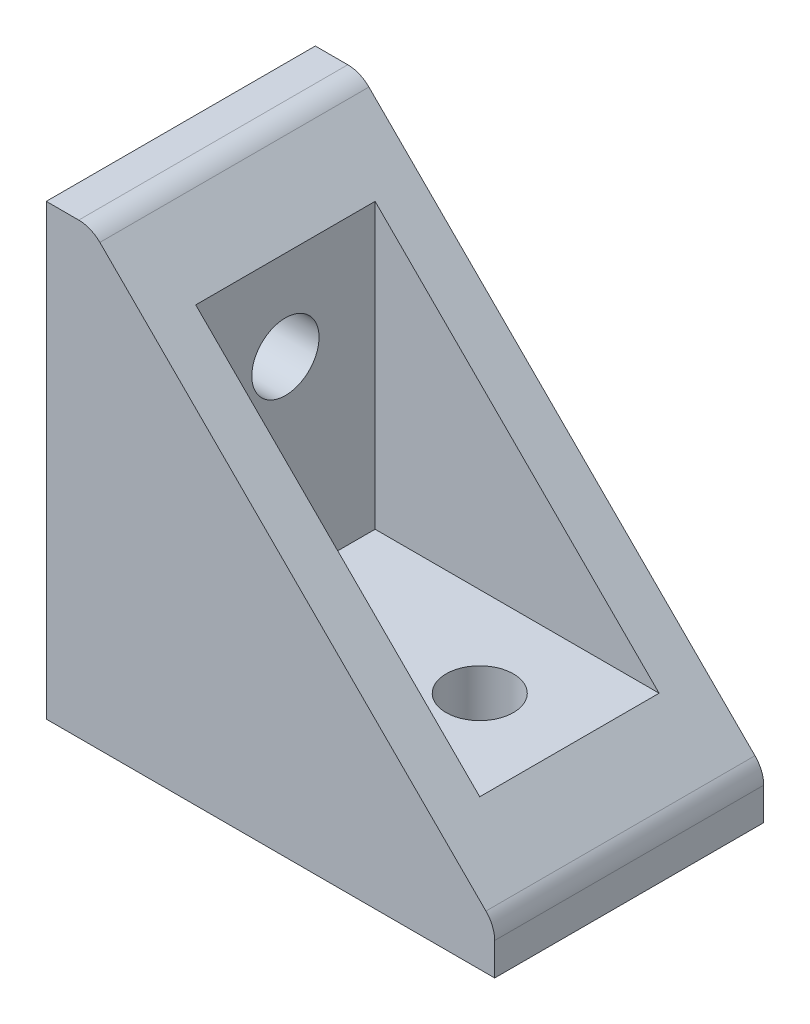
ISO-10303-21;
HEADER;
FILE_DESCRIPTION(('STEP AP214'),'2;1');
FILE_NAME('part.step','',(''),(''),'','','');
FILE_SCHEMA(('AUTOMOTIVE_DESIGN { 1 0 10303 214 1 1 1 1 }'));
ENDSEC;
DATA;
#1=APPLICATION_CONTEXT('core data for automotive mechanical design processes');
#2=APPLICATION_PROTOCOL_DEFINITION('international standard','automotive_design',2000,#1);
#3=PRODUCT_CONTEXT('',#1,'mechanical');
#4=PRODUCT('Part','Part','',(#3));
#5=PRODUCT_RELATED_PRODUCT_CATEGORY('part','',(#4));
#6=PRODUCT_DEFINITION_FORMATION('','',#4);
#7=PRODUCT_DEFINITION_CONTEXT('part definition',#1,'design');
#8=PRODUCT_DEFINITION('design','',#6,#7);
#9=PRODUCT_DEFINITION_SHAPE('','',#8);
#10=(LENGTH_UNIT() NAMED_UNIT(*) SI_UNIT(.MILLI.,.METRE.));
#11=(NAMED_UNIT(*) PLANE_ANGLE_UNIT() SI_UNIT($,.RADIAN.));
#12=(NAMED_UNIT(*) SI_UNIT($,.STERADIAN.) SOLID_ANGLE_UNIT());
#13=UNCERTAINTY_MEASURE_WITH_UNIT(LENGTH_MEASURE(1.E-05),#10,'distance_accuracy_value','');
#14=(GEOMETRIC_REPRESENTATION_CONTEXT(3) GLOBAL_UNCERTAINTY_ASSIGNED_CONTEXT((#13)) GLOBAL_UNIT_ASSIGNED_CONTEXT((#10,
#11,#12)) REPRESENTATION_CONTEXT('',''));
#15=CARTESIAN_POINT('',(0.,0.,0.));
#16=DIRECTION('',(0.,0.,1.));
#17=DIRECTION('',(1.,0.,0.));
#18=AXIS2_PLACEMENT_3D('',#15,#16,#17);
#19=CARTESIAN_POINT('',(0.,0.,-9.));
#20=DIRECTION('',(0.,-1.,0.));
#21=DIRECTION('',(0.,0.,-1.));
#22=AXIS2_PLACEMENT_3D('',#19,#20,#21);
#23=PLANE('',#22);
#24=CARTESIAN_POINT('',(20.,0.,0.));
#25=DIRECTION('',(0.,1.,0.));
#26=DIRECTION('',(-1.,0.,0.));
#27=AXIS2_PLACEMENT_3D('',#24,#25,#26);
#28=CIRCLE('',#27,2.25);
#29=CARTESIAN_POINT('',(17.75,0.,0.));
#30=VERTEX_POINT('',#29);
#31=EDGE_CURVE('E164',#30,#30,#28,.T.);
#32=ORIENTED_EDGE('',*,*,#31,.T.);
#33=EDGE_LOOP('',(#32));
#34=FACE_BOUND('',#33,.T.);
#35=DIRECTION('',(0.,0.,-1.));
#36=VECTOR('',#35,1.);
#37=CARTESIAN_POINT('',(14.,0.,-3.));
#38=LINE('',#37,#36);
#39=CARTESIAN_POINT('',(14.,0.,3.));
#40=VERTEX_POINT('',#39);
#41=CARTESIAN_POINT('',(14.,0.,-3.));
#42=VERTEX_POINT('',#41);
#43=EDGE_CURVE('E185',#40,#42,#38,.T.);
#44=ORIENTED_EDGE('',*,*,#43,.T.);
#45=DIRECTION('',(-1.,0.,0.));
#46=VECTOR('',#45,1.);
#47=CARTESIAN_POINT('',(0.,0.,-3.));
#48=LINE('',#47,#46);
#49=CARTESIAN_POINT('',(0.,0.,-3.));
#50=VERTEX_POINT('',#49);
#51=EDGE_CURVE('E159',#42,#50,#48,.T.);
#52=ORIENTED_EDGE('',*,*,#51,.T.);
#53=DIRECTION('',(0.,0.,1.));
#54=VECTOR('',#53,1.);
#55=CARTESIAN_POINT('',(0.,0.,-9.));
#56=LINE('',#55,#54);
#57=CARTESIAN_POINT('',(0.,0.,-9.));
#58=VERTEX_POINT('',#57);
#59=EDGE_CURVE('E282',#58,#50,#56,.T.);
#60=ORIENTED_EDGE('',*,*,#59,.F.);
#61=DIRECTION('',(1.,0.,0.));
#62=VECTOR('',#61,1.);
#63=CARTESIAN_POINT('',(0.,0.,-9.));
#64=LINE('',#63,#62);
#65=CARTESIAN_POINT('',(30.,0.,-9.));
#66=VERTEX_POINT('',#65);
#67=EDGE_CURVE('E265',#58,#66,#64,.T.);
#68=ORIENTED_EDGE('',*,*,#67,.T.);
#69=DIRECTION('',(0.,0.,1.));
#70=VECTOR('',#69,1.);
#71=CARTESIAN_POINT('',(30.,0.,-9.));
#72=LINE('',#71,#70);
#73=CARTESIAN_POINT('',(30.,0.,9.));
#74=VERTEX_POINT('',#73);
#75=EDGE_CURVE('E280',#66,#74,#72,.T.);
#76=ORIENTED_EDGE('',*,*,#75,.T.);
#77=DIRECTION('',(1.,0.,0.));
#78=VECTOR('',#77,1.);
#79=CARTESIAN_POINT('',(0.,0.,9.));
#80=LINE('',#79,#78);
#81=CARTESIAN_POINT('',(0.,0.,9.));
#82=VERTEX_POINT('',#81);
#83=EDGE_CURVE('E251',#82,#74,#80,.T.);
#84=ORIENTED_EDGE('',*,*,#83,.F.);
#85=CARTESIAN_POINT('',(0.,0.,3.));
#86=VERTEX_POINT('',#85);
#87=EDGE_CURVE('E275',#86,#82,#56,.T.);
#88=ORIENTED_EDGE('',*,*,#87,.F.);
#89=DIRECTION('',(1.,0.,0.));
#90=VECTOR('',#89,1.);
#91=CARTESIAN_POINT('',(0.,0.,3.));
#92=LINE('',#91,#90);
#93=EDGE_CURVE('E187',#86,#40,#92,.T.);
#94=ORIENTED_EDGE('',*,*,#93,.T.);
#95=EDGE_LOOP('',(#44,#52,#60,#68,#76,#84,#88,#94));
#96=FACE_BOUND('',#95,.T.);
#97=ADVANCED_FACE('F34',(#34,#96),#23,.T.);
#98=DIRECTION('',(1.,0.,0.));
#99=VECTOR('',#98,1.);
#100=CARTESIAN_POINT('',(-3.,0.,-3.));
#101=LINE('',#100,#99);
#102=CARTESIAN_POINT('',(-3.,0.,-3.));
#103=VERTEX_POINT('',#102);
#104=EDGE_CURVE('E226',#103,#50,#101,.T.);
#105=ORIENTED_EDGE('',*,*,#104,.T.);
#106=DIRECTION('',(0.,0.,1.));
#107=VECTOR('',#106,1.);
#108=CARTESIAN_POINT('',(0.,0.,-3.));
#109=LINE('',#108,#107);
#110=EDGE_CURVE('E175',#50,#86,#109,.T.);
#111=ORIENTED_EDGE('',*,*,#110,.T.);
#112=DIRECTION('',(1.,0.,0.));
#113=VECTOR('',#112,1.);
#114=CARTESIAN_POINT('',(-3.,0.,3.));
#115=LINE('',#114,#113);
#116=CARTESIAN_POINT('',(-3.,0.,3.));
#117=VERTEX_POINT('',#116);
#118=EDGE_CURVE('E223',#117,#86,#115,.T.);
#119=ORIENTED_EDGE('',*,*,#118,.F.);
#120=DIRECTION('',(0.,0.,1.));
#121=VECTOR('',#120,1.);
#122=CARTESIAN_POINT('',(-3.,0.,-3.));
#123=LINE('',#122,#121);
#124=EDGE_CURVE('E202',#103,#117,#123,.T.);
#125=ORIENTED_EDGE('',*,*,#124,.F.);
#126=EDGE_LOOP('',(#105,#111,#119,#125));
#127=FACE_BOUND('',#126,.T.);
#128=ADVANCED_FACE('F339',(#127),#23,.T.);
#129=CARTESIAN_POINT('',(0.,30.,-9.));
#130=DIRECTION('',(-1.,0.,0.));
#131=DIRECTION('',(0.,-1.,0.));
#132=AXIS2_PLACEMENT_3D('',#129,#130,#131);
#133=PLANE('',#132);
#134=DIRECTION('',(0.,-1.,0.));
#135=VECTOR('',#134,1.);
#136=CARTESIAN_POINT('',(0.,0.,-3.));
#137=LINE('',#136,#135);
#138=CARTESIAN_POINT('',(0.,14.,-3.));
#139=VERTEX_POINT('',#138);
#140=EDGE_CURVE('E210',#139,#50,#137,.T.);
#141=ORIENTED_EDGE('',*,*,#140,.F.);
#142=DIRECTION('',(0.,0.,-1.));
#143=VECTOR('',#142,1.);
#144=CARTESIAN_POINT('',(0.,14.,-3.));
#145=LINE('',#144,#143);
#146=CARTESIAN_POINT('',(0.,14.,3.));
#147=VERTEX_POINT('',#146);
#148=EDGE_CURVE('E203',#147,#139,#145,.T.);
#149=ORIENTED_EDGE('',*,*,#148,.F.);
#150=DIRECTION('',(0.,1.,0.));
#151=VECTOR('',#150,1.);
#152=CARTESIAN_POINT('',(0.,0.,3.));
#153=LINE('',#152,#151);
#154=EDGE_CURVE('E213',#86,#147,#153,.T.);
#155=ORIENTED_EDGE('',*,*,#154,.F.);
#156=ORIENTED_EDGE('',*,*,#87,.T.);
#157=DIRECTION('',(0.,-1.,0.));
#158=VECTOR('',#157,1.);
#159=CARTESIAN_POINT('',(0.,30.,9.));
#160=LINE('',#159,#158);
#161=CARTESIAN_POINT('',(0.,30.,9.));
#162=VERTEX_POINT('',#161);
#163=EDGE_CURVE('E248',#162,#82,#160,.T.);
#164=ORIENTED_EDGE('',*,*,#163,.F.);
#165=DIRECTION('',(0.,0.,1.));
#166=VECTOR('',#165,1.);
#167=CARTESIAN_POINT('',(0.,30.,-9.));
#168=LINE('',#167,#166);
#169=CARTESIAN_POINT('',(0.,30.,-9.));
#170=VERTEX_POINT('',#169);
#171=EDGE_CURVE('E276',#170,#162,#168,.T.);
#172=ORIENTED_EDGE('',*,*,#171,.F.);
#173=DIRECTION('',(0.,-1.,0.));
#174=VECTOR('',#173,1.);
#175=CARTESIAN_POINT('',(0.,30.,-9.));
#176=LINE('',#175,#174);
#177=EDGE_CURVE('E262',#170,#58,#176,.T.);
#178=ORIENTED_EDGE('',*,*,#177,.T.);
#179=ORIENTED_EDGE('',*,*,#59,.T.);
#180=EDGE_LOOP('',(#141,#149,#155,#156,#164,#172,#178,#179));
#181=FACE_BOUND('',#180,.T.);
#182=CARTESIAN_POINT('',(0.,20.,0.));
#183=DIRECTION('',(-1.,0.,0.));
#184=DIRECTION('',(0.,-1.,0.));
#185=AXIS2_PLACEMENT_3D('',#182,#183,#184);
#186=CIRCLE('',#185,2.25);
#187=CARTESIAN_POINT('',(0.,17.75,0.));
#188=VERTEX_POINT('',#187);
#189=EDGE_CURVE('E245',#188,#188,#186,.T.);
#190=ORIENTED_EDGE('',*,*,#189,.F.);
#191=EDGE_LOOP('',(#190));
#192=FACE_BOUND('',#191,.T.);
#193=ADVANCED_FACE('F331',(#181,#192),#133,.T.);
#194=CARTESIAN_POINT('',(3.,30.,-9.));
#195=DIRECTION('',(0.,1.,0.));
#196=DIRECTION('',(0.,0.,1.));
#197=AXIS2_PLACEMENT_3D('',#194,#195,#196);
#198=PLANE('',#197);
#199=DIRECTION('',(-1.,0.,0.));
#200=VECTOR('',#199,1.);
#201=CARTESIAN_POINT('',(3.,30.,9.));
#202=LINE('',#201,#200);
#203=CARTESIAN_POINT('',(2.17157287525381,30.,9.));
#204=VERTEX_POINT('',#203);
#205=EDGE_CURVE('E260',#204,#162,#202,.T.);
#206=ORIENTED_EDGE('',*,*,#205,.F.);
#207=DIRECTION('',(0.,0.,1.));
#208=VECTOR('',#207,1.);
#209=CARTESIAN_POINT('',(2.17157287525381,30.,-9.));
#210=LINE('',#209,#208);
#211=CARTESIAN_POINT('',(2.17157287525381,30.,-9.));
#212=VERTEX_POINT('',#211);
#213=EDGE_CURVE('E11',#204,#212,#210,.F.);
#214=ORIENTED_EDGE('',*,*,#213,.T.);
#215=DIRECTION('',(-1.,0.,0.));
#216=VECTOR('',#215,1.);
#217=CARTESIAN_POINT('',(3.,30.,-9.));
#218=LINE('',#217,#216);
#219=EDGE_CURVE('E273',#212,#170,#218,.T.);
#220=ORIENTED_EDGE('',*,*,#219,.T.);
#221=ORIENTED_EDGE('',*,*,#171,.T.);
#222=EDGE_LOOP('',(#206,#214,#220,#221));
#223=FACE_BOUND('',#222,.T.);
#224=ADVANCED_FACE('F326',(#223),#198,.T.);
#225=CARTESIAN_POINT('',(30.,3.,-9.));
#226=DIRECTION('',(0.707106781186547,0.707106781186548,0.));
#227=DIRECTION('',(-0.707106781186548,0.707106781186547,0.));
#228=AXIS2_PLACEMENT_3D('',#225,#226,#227);
#229=PLANE('',#228);
#230=DIRECTION('',(0.,0.,1.));
#231=VECTOR('',#230,1.);
#232=CARTESIAN_POINT('',(7.,26.,-8.99999999999999));
#233=LINE('',#232,#231);
#234=CARTESIAN_POINT('',(7.,26.,-6.));
#235=VERTEX_POINT('',#234);
#236=CARTESIAN_POINT('',(7.,26.,6.));
#237=VERTEX_POINT('',#236);
#238=EDGE_CURVE('E243',#235,#237,#233,.T.);
#239=ORIENTED_EDGE('',*,*,#238,.F.);
#240=DIRECTION('',(-0.707106781186548,0.707106781186547,0.));
#241=VECTOR('',#240,1.);
#242=CARTESIAN_POINT('',(30.,3.,-6.));
#243=LINE('',#242,#241);
#244=CARTESIAN_POINT('',(26.,6.99999999999999,-6.));
#245=VERTEX_POINT('',#244);
#246=EDGE_CURVE('E292',#245,#235,#243,.T.);
#247=ORIENTED_EDGE('',*,*,#246,.F.);
#248=DIRECTION('',(0.,0.,1.));
#249=VECTOR('',#248,1.);
#250=CARTESIAN_POINT('',(26.,6.99999999999999,-9.));
#251=LINE('',#250,#249);
#252=CARTESIAN_POINT('',(26.,6.99999999999999,6.));
#253=VERTEX_POINT('',#252);
#254=EDGE_CURVE('E279',#245,#253,#251,.T.);
#255=ORIENTED_EDGE('',*,*,#254,.T.);
#256=DIRECTION('',(0.707106781186548,-0.707106781186547,0.));
#257=VECTOR('',#256,1.);
#258=CARTESIAN_POINT('',(30.,3.,6.));
#259=LINE('',#258,#257);
#260=EDGE_CURVE('E289',#237,#253,#259,.T.);
#261=ORIENTED_EDGE('',*,*,#260,.F.);
#262=EDGE_LOOP('',(#239,#247,#255,#261));
#263=FACE_BOUND('',#262,.T.);
#264=DIRECTION('',(-0.707106781186548,0.707106781186547,0.));
#265=VECTOR('',#264,1.);
#266=CARTESIAN_POINT('',(30.,3.,9.));
#267=LINE('',#266,#265);
#268=CARTESIAN_POINT('',(29.4142135623731,3.58578643762691,9.));
#269=VERTEX_POINT('',#268);
#270=CARTESIAN_POINT('',(3.5857864376269,29.4142135623731,9.));
#271=VERTEX_POINT('',#270);
#272=EDGE_CURVE('E257',#269,#271,#267,.T.);
#273=ORIENTED_EDGE('',*,*,#272,.F.);
#274=DIRECTION('',(0.,0.,1.));
#275=VECTOR('',#274,1.);
#276=CARTESIAN_POINT('',(29.4142135623731,3.58578643762691,-9.));
#277=LINE('',#276,#275);
#278=CARTESIAN_POINT('',(29.4142135623731,3.58578643762691,-9.));
#279=VERTEX_POINT('',#278);
#280=EDGE_CURVE('E306',#269,#279,#277,.F.);
#281=ORIENTED_EDGE('',*,*,#280,.T.);
#282=DIRECTION('',(-0.707106781186548,0.707106781186547,0.));
#283=VECTOR('',#282,1.);
#284=CARTESIAN_POINT('',(30.,3.,-9.));
#285=LINE('',#284,#283);
#286=CARTESIAN_POINT('',(3.5857864376269,29.4142135623731,-9.));
#287=VERTEX_POINT('',#286);
#288=EDGE_CURVE('E271',#279,#287,#285,.T.);
#289=ORIENTED_EDGE('',*,*,#288,.T.);
#290=DIRECTION('',(0.,0.,1.));
#291=VECTOR('',#290,1.);
#292=CARTESIAN_POINT('',(3.5857864376269,29.4142135623731,-9.));
#293=LINE('',#292,#291);
#294=EDGE_CURVE('E303',#287,#271,#293,.T.);
#295=ORIENTED_EDGE('',*,*,#294,.T.);
#296=EDGE_LOOP('',(#273,#281,#289,#295));
#297=FACE_BOUND('',#296,.T.);
#298=ADVANCED_FACE('F323',(#263,#297),#229,.T.);
#299=CARTESIAN_POINT('',(30.,0.,-9.));
#300=DIRECTION('',(1.,0.,0.));
#301=DIRECTION('',(0.,0.,-1.));
#302=AXIS2_PLACEMENT_3D('',#299,#300,#301);
#303=PLANE('',#302);
#304=DIRECTION('',(0.,1.,0.));
#305=VECTOR('',#304,1.);
#306=CARTESIAN_POINT('',(30.,0.,-9.));
#307=LINE('',#306,#305);
#308=CARTESIAN_POINT('',(30.,2.17157287525381,-9.));
#309=VERTEX_POINT('',#308);
#310=EDGE_CURVE('E268',#66,#309,#307,.T.);
#311=ORIENTED_EDGE('',*,*,#310,.T.);
#312=DIRECTION('',(0.,0.,1.));
#313=VECTOR('',#312,1.);
#314=CARTESIAN_POINT('',(30.,2.17157287525381,-9.));
#315=LINE('',#314,#313);
#316=CARTESIAN_POINT('',(30.,2.17157287525381,9.));
#317=VERTEX_POINT('',#316);
#318=EDGE_CURVE('E294',#309,#317,#315,.T.);
#319=ORIENTED_EDGE('',*,*,#318,.T.);
#320=DIRECTION('',(0.,1.,0.));
#321=VECTOR('',#320,1.);
#322=CARTESIAN_POINT('',(30.,0.,9.));
#323=LINE('',#322,#321);
#324=EDGE_CURVE('E254',#74,#317,#323,.T.);
#325=ORIENTED_EDGE('',*,*,#324,.F.);
#326=ORIENTED_EDGE('',*,*,#75,.F.);
#327=EDGE_LOOP('',(#311,#319,#325,#326));
#328=FACE_BOUND('',#327,.T.);
#329=ADVANCED_FACE('F316',(#328),#303,.T.);
#330=CARTESIAN_POINT('',(0.,0.,-9.));
#331=DIRECTION('',(0.,0.,1.));
#332=DIRECTION('',(1.,0.,0.));
#333=AXIS2_PLACEMENT_3D('',#330,#331,#332);
#334=PLANE('',#333);
#335=ORIENTED_EDGE('',*,*,#288,.F.);
#336=CARTESIAN_POINT('',(28.,2.17157287525381,-9.));
#337=DIRECTION('',(0.,0.,1.));
#338=DIRECTION('',(1.,0.,0.));
#339=AXIS2_PLACEMENT_3D('',#336,#337,#338);
#340=CIRCLE('',#339,2.);
#341=EDGE_CURVE('E42',#279,#309,#340,.F.);
#342=ORIENTED_EDGE('',*,*,#341,.T.);
#343=ORIENTED_EDGE('',*,*,#310,.F.);
#344=ORIENTED_EDGE('',*,*,#67,.F.);
#345=ORIENTED_EDGE('',*,*,#177,.F.);
#346=ORIENTED_EDGE('',*,*,#219,.F.);
#347=CARTESIAN_POINT('',(2.17157287525381,28.,-9.));
#348=DIRECTION('',(0.,0.,1.));
#349=DIRECTION('',(1.,0.,0.));
#350=AXIS2_PLACEMENT_3D('',#347,#348,#349);
#351=CIRCLE('',#350,2.);
#352=EDGE_CURVE('E54',#212,#287,#351,.F.);
#353=ORIENTED_EDGE('',*,*,#352,.T.);
#354=EDGE_LOOP('',(#335,#342,#343,#344,#345,#346,#353));
#355=FACE_BOUND('',#354,.T.);
#356=ADVANCED_FACE('F310',(#355),#334,.F.);
#357=CARTESIAN_POINT('',(0.,0.,9.));
#358=DIRECTION('',(0.,0.,1.));
#359=DIRECTION('',(1.,0.,0.));
#360=AXIS2_PLACEMENT_3D('',#357,#358,#359);
#361=PLANE('',#360);
#362=ORIENTED_EDGE('',*,*,#324,.T.);
#363=CARTESIAN_POINT('',(28.,2.17157287525381,9.));
#364=DIRECTION('',(0.,0.,1.));
#365=DIRECTION('',(1.,0.,0.));
#366=AXIS2_PLACEMENT_3D('',#363,#364,#365);
#367=CIRCLE('',#366,2.);
#368=EDGE_CURVE('E301',#317,#269,#367,.T.);
#369=ORIENTED_EDGE('',*,*,#368,.T.);
#370=ORIENTED_EDGE('',*,*,#272,.T.);
#371=CARTESIAN_POINT('',(2.17157287525381,28.,9.));
#372=DIRECTION('',(0.,0.,1.));
#373=DIRECTION('',(1.,0.,0.));
#374=AXIS2_PLACEMENT_3D('',#371,#372,#373);
#375=CIRCLE('',#374,2.);
#376=EDGE_CURVE('E299',#271,#204,#375,.T.);
#377=ORIENTED_EDGE('',*,*,#376,.T.);
#378=ORIENTED_EDGE('',*,*,#205,.T.);
#379=ORIENTED_EDGE('',*,*,#163,.T.);
#380=ORIENTED_EDGE('',*,*,#83,.T.);
#381=EDGE_LOOP('',(#362,#369,#370,#377,#378,#379,#380));
#382=FACE_BOUND('',#381,.T.);
#383=ADVANCED_FACE('F321',(#382),#361,.T.);
#384=CARTESIAN_POINT('',(30.,20.,0.));
#385=DIRECTION('',(-1.,0.,0.));
#386=DIRECTION('',(0.,-1.,0.));
#387=AXIS2_PLACEMENT_3D('',#384,#385,#386);
#388=CYLINDRICAL_SURFACE('',#387,2.25);
#389=CARTESIAN_POINT('',(7.,20.,0.));
#390=DIRECTION('',(-1.,0.,0.));
#391=DIRECTION('',(0.,0.,1.));
#392=AXIS2_PLACEMENT_3D('',#389,#390,#391);
#393=CIRCLE('',#392,2.25);
#394=CARTESIAN_POINT('',(7.,20.,2.25));
#395=VERTEX_POINT('',#394);
#396=EDGE_CURVE('E240',#395,#395,#393,.F.);
#397=ORIENTED_EDGE('',*,*,#396,.T.);
#398=EDGE_LOOP('',(#397));
#399=FACE_BOUND('',#398,.T.);
#400=ORIENTED_EDGE('',*,*,#189,.T.);
#401=EDGE_LOOP('',(#400));
#402=FACE_BOUND('',#401,.T.);
#403=ADVANCED_FACE('F456',(#399,#402),#388,.F.);
#404=CARTESIAN_POINT('',(7.,6.99999999999999,-6.));
#405=DIRECTION('',(-1.,0.,0.));
#406=DIRECTION('',(0.,0.,1.));
#407=AXIS2_PLACEMENT_3D('',#404,#405,#406);
#408=PLANE('',#407);
#409=ORIENTED_EDGE('',*,*,#238,.T.);
#410=DIRECTION('',(0.,1.,0.));
#411=VECTOR('',#410,1.);
#412=CARTESIAN_POINT('',(7.,6.99999999999999,6.));
#413=LINE('',#412,#411);
#414=CARTESIAN_POINT('',(7.,6.99999999999999,6.));
#415=VERTEX_POINT('',#414);
#416=EDGE_CURVE('E236',#415,#237,#413,.T.);
#417=ORIENTED_EDGE('',*,*,#416,.F.);
#418=DIRECTION('',(0.,0.,1.));
#419=VECTOR('',#418,1.);
#420=CARTESIAN_POINT('',(7.,6.99999999999999,-6.));
#421=LINE('',#420,#419);
#422=CARTESIAN_POINT('',(7.,6.99999999999999,-6.));
#423=VERTEX_POINT('',#422);
#424=EDGE_CURVE('E229',#423,#415,#421,.T.);
#425=ORIENTED_EDGE('',*,*,#424,.F.);
#426=DIRECTION('',(0.,1.,0.));
#427=VECTOR('',#426,1.);
#428=CARTESIAN_POINT('',(7.,6.99999999999999,-6.));
#429=LINE('',#428,#427);
#430=EDGE_CURVE('E237',#423,#235,#429,.T.);
#431=ORIENTED_EDGE('',*,*,#430,.T.);
#432=EDGE_LOOP('',(#409,#417,#425,#431));
#433=FACE_BOUND('',#432,.T.);
#434=ORIENTED_EDGE('',*,*,#396,.F.);
#435=EDGE_LOOP('',(#434));
#436=FACE_BOUND('',#435,.T.);
#437=ADVANCED_FACE('F475',(#433,#436),#408,.F.);
#438=CARTESIAN_POINT('',(7.,6.99999999999999,-6.));
#439=DIRECTION('',(0.,0.,-1.));
#440=DIRECTION('',(-1.,0.,0.));
#441=AXIS2_PLACEMENT_3D('',#438,#439,#440);
#442=PLANE('',#441);
#443=ORIENTED_EDGE('',*,*,#246,.T.);
#444=ORIENTED_EDGE('',*,*,#430,.F.);
#445=DIRECTION('',(-1.,0.,0.));
#446=VECTOR('',#445,1.);
#447=CARTESIAN_POINT('',(7.,6.99999999999999,-6.));
#448=LINE('',#447,#446);
#449=EDGE_CURVE('E234',#245,#423,#448,.T.);
#450=ORIENTED_EDGE('',*,*,#449,.F.);
#451=EDGE_LOOP('',(#443,#444,#450));
#452=FACE_BOUND('',#451,.T.);
#453=ADVANCED_FACE('F482',(#452),#442,.F.);
#454=CARTESIAN_POINT('',(7.,6.99999999999999,6.));
#455=DIRECTION('',(0.,0.,1.));
#456=DIRECTION('',(1.,0.,0.));
#457=AXIS2_PLACEMENT_3D('',#454,#455,#456);
#458=PLANE('',#457);
#459=ORIENTED_EDGE('',*,*,#260,.T.);
#460=DIRECTION('',(1.,0.,0.));
#461=VECTOR('',#460,1.);
#462=CARTESIAN_POINT('',(7.,6.99999999999999,6.));
#463=LINE('',#462,#461);
#464=EDGE_CURVE('E232',#415,#253,#463,.T.);
#465=ORIENTED_EDGE('',*,*,#464,.F.);
#466=ORIENTED_EDGE('',*,*,#416,.T.);
#467=EDGE_LOOP('',(#459,#465,#466));
#468=FACE_BOUND('',#467,.T.);
#469=ADVANCED_FACE('F490',(#468),#458,.F.);
#470=CARTESIAN_POINT('',(0.,6.99999999999999,0.));
#471=DIRECTION('',(0.,1.,0.));
#472=DIRECTION('',(0.,0.,1.));
#473=AXIS2_PLACEMENT_3D('',#470,#471,#472);
#474=PLANE('',#473);
#475=CARTESIAN_POINT('',(20.,6.99999999999999,0.));
#476=DIRECTION('',(0.,1.,0.));
#477=DIRECTION('',(0.,0.,1.));
#478=AXIS2_PLACEMENT_3D('',#475,#476,#477);
#479=CIRCLE('',#478,2.25);
#480=CARTESIAN_POINT('',(20.,6.99999999999999,2.25));
#481=VERTEX_POINT('',#480);
#482=EDGE_CURVE('E198',#481,#481,#479,.F.);
#483=ORIENTED_EDGE('',*,*,#482,.T.);
#484=EDGE_LOOP('',(#483));
#485=FACE_BOUND('',#484,.T.);
#486=ORIENTED_EDGE('',*,*,#449,.T.);
#487=ORIENTED_EDGE('',*,*,#424,.T.);
#488=ORIENTED_EDGE('',*,*,#464,.T.);
#489=ORIENTED_EDGE('',*,*,#254,.F.);
#490=EDGE_LOOP('',(#486,#487,#488,#489));
#491=FACE_BOUND('',#490,.T.);
#492=ADVANCED_FACE('F498',(#485,#491),#474,.T.);
#493=CARTESIAN_POINT('',(-3.,0.,-3.));
#494=DIRECTION('',(0.,0.,1.));
#495=DIRECTION('',(1.,0.,0.));
#496=AXIS2_PLACEMENT_3D('',#493,#494,#495);
#497=PLANE('',#496);
#498=ORIENTED_EDGE('',*,*,#140,.T.);
#499=ORIENTED_EDGE('',*,*,#104,.F.);
#500=DIRECTION('',(0.,-1.,0.));
#501=VECTOR('',#500,1.);
#502=CARTESIAN_POINT('',(-3.,0.,-3.));
#503=LINE('',#502,#501);
#504=CARTESIAN_POINT('',(-3.,14.,-3.));
#505=VERTEX_POINT('',#504);
#506=EDGE_CURVE('E199',#505,#103,#503,.T.);
#507=ORIENTED_EDGE('',*,*,#506,.F.);
#508=DIRECTION('',(1.,0.,0.));
#509=VECTOR('',#508,1.);
#510=CARTESIAN_POINT('',(-3.,14.,-3.));
#511=LINE('',#510,#509);
#512=EDGE_CURVE('E209',#505,#139,#511,.T.);
#513=ORIENTED_EDGE('',*,*,#512,.T.);
#514=EDGE_LOOP('',(#498,#499,#507,#513));
#515=FACE_BOUND('',#514,.T.);
#516=ADVANCED_FACE('F344',(#515),#497,.F.);
#517=CARTESIAN_POINT('',(-3.,0.,3.));
#518=DIRECTION('',(0.,0.,-1.));
#519=DIRECTION('',(-1.,0.,0.));
#520=AXIS2_PLACEMENT_3D('',#517,#518,#519);
#521=PLANE('',#520);
#522=ORIENTED_EDGE('',*,*,#154,.T.);
#523=DIRECTION('',(1.,0.,0.));
#524=VECTOR('',#523,1.);
#525=CARTESIAN_POINT('',(-3.,14.,3.));
#526=LINE('',#525,#524);
#527=CARTESIAN_POINT('',(-3.,14.,3.));
#528=VERTEX_POINT('',#527);
#529=EDGE_CURVE('E220',#528,#147,#526,.T.);
#530=ORIENTED_EDGE('',*,*,#529,.F.);
#531=DIRECTION('',(0.,1.,0.));
#532=VECTOR('',#531,1.);
#533=CARTESIAN_POINT('',(-3.,0.,3.));
#534=LINE('',#533,#532);
#535=EDGE_CURVE('E205',#117,#528,#534,.T.);
#536=ORIENTED_EDGE('',*,*,#535,.F.);
#537=ORIENTED_EDGE('',*,*,#118,.T.);
#538=EDGE_LOOP('',(#522,#530,#536,#537));
#539=FACE_BOUND('',#538,.T.);
#540=ADVANCED_FACE('F351',(#539),#521,.F.);
#541=CARTESIAN_POINT('',(-3.,14.,-3.));
#542=DIRECTION('',(0.,-1.,0.));
#543=DIRECTION('',(1.,0.,0.));
#544=AXIS2_PLACEMENT_3D('',#541,#542,#543);
#545=PLANE('',#544);
#546=ORIENTED_EDGE('',*,*,#148,.T.);
#547=ORIENTED_EDGE('',*,*,#512,.F.);
#548=DIRECTION('',(0.,0.,-1.));
#549=VECTOR('',#548,1.);
#550=CARTESIAN_POINT('',(-3.,14.,-3.));
#551=LINE('',#550,#549);
#552=EDGE_CURVE('E207',#528,#505,#551,.T.);
#553=ORIENTED_EDGE('',*,*,#552,.F.);
#554=ORIENTED_EDGE('',*,*,#529,.T.);
#555=EDGE_LOOP('',(#546,#547,#553,#554));
#556=FACE_BOUND('',#555,.T.);
#557=ADVANCED_FACE('F348',(#556),#545,.F.);
#558=CARTESIAN_POINT('',(-3.,0.,0.));
#559=DIRECTION('',(1.,0.,0.));
#560=DIRECTION('',(0.,1.,0.));
#561=AXIS2_PLACEMENT_3D('',#558,#559,#560);
#562=PLANE('',#561);
#563=ORIENTED_EDGE('',*,*,#506,.T.);
#564=ORIENTED_EDGE('',*,*,#124,.T.);
#565=ORIENTED_EDGE('',*,*,#535,.T.);
#566=ORIENTED_EDGE('',*,*,#552,.T.);
#567=EDGE_LOOP('',(#563,#564,#565,#566));
#568=FACE_BOUND('',#567,.T.);
#569=ADVANCED_FACE('F354',(#568),#562,.F.);
#570=CARTESIAN_POINT('',(20.,30.,0.));
#571=DIRECTION('',(0.,-1.,0.));
#572=DIRECTION('',(1.,0.,0.));
#573=AXIS2_PLACEMENT_3D('',#570,#571,#572);
#574=CYLINDRICAL_SURFACE('',#573,2.25);
#575=ORIENTED_EDGE('',*,*,#482,.F.);
#576=EDGE_LOOP('',(#575));
#577=FACE_BOUND('',#576,.T.);
#578=ORIENTED_EDGE('',*,*,#31,.F.);
#579=EDGE_LOOP('',(#578));
#580=FACE_BOUND('',#579,.T.);
#581=ADVANCED_FACE('F356',(#577,#580),#574,.F.);
#582=CARTESIAN_POINT('',(0.,-3.,-3.));
#583=DIRECTION('',(0.,0.,-1.));
#584=DIRECTION('',(-1.,0.,0.));
#585=AXIS2_PLACEMENT_3D('',#582,#583,#584);
#586=PLANE('',#585);
#587=ORIENTED_EDGE('',*,*,#51,.F.);
#588=DIRECTION('',(0.,1.,0.));
#589=VECTOR('',#588,1.);
#590=CARTESIAN_POINT('',(14.,-3.,-3.));
#591=LINE('',#590,#589);
#592=CARTESIAN_POINT('',(14.,-3.,-3.));
#593=VERTEX_POINT('',#592);
#594=EDGE_CURVE('E153',#593,#42,#591,.T.);
#595=ORIENTED_EDGE('',*,*,#594,.F.);
#596=DIRECTION('',(-1.,0.,0.));
#597=VECTOR('',#596,1.);
#598=CARTESIAN_POINT('',(0.,-3.,-3.));
#599=LINE('',#598,#597);
#600=CARTESIAN_POINT('',(0.,-3.,-3.));
#601=VERTEX_POINT('',#600);
#602=EDGE_CURVE('E156',#593,#601,#599,.T.);
#603=ORIENTED_EDGE('',*,*,#602,.T.);
#604=DIRECTION('',(0.,1.,0.));
#605=VECTOR('',#604,1.);
#606=CARTESIAN_POINT('',(0.,-3.,-3.));
#607=LINE('',#606,#605);
#608=EDGE_CURVE('E183',#601,#50,#607,.T.);
#609=ORIENTED_EDGE('',*,*,#608,.T.);
#610=EDGE_LOOP('',(#587,#595,#603,#609));
#611=FACE_BOUND('',#610,.T.);
#612=ADVANCED_FACE('F155',(#611),#586,.T.);
#613=CARTESIAN_POINT('',(14.,-3.,-3.));
#614=DIRECTION('',(1.,0.,0.));
#615=DIRECTION('',(0.,1.,0.));
#616=AXIS2_PLACEMENT_3D('',#613,#614,#615);
#617=PLANE('',#616);
#618=ORIENTED_EDGE('',*,*,#43,.F.);
#619=DIRECTION('',(0.,1.,0.));
#620=VECTOR('',#619,1.);
#621=CARTESIAN_POINT('',(14.,-3.,3.));
#622=LINE('',#621,#620);
#623=CARTESIAN_POINT('',(14.,-3.,3.));
#624=VERTEX_POINT('',#623);
#625=EDGE_CURVE('E165',#624,#40,#622,.T.);
#626=ORIENTED_EDGE('',*,*,#625,.F.);
#627=DIRECTION('',(0.,0.,-1.));
#628=VECTOR('',#627,1.);
#629=CARTESIAN_POINT('',(14.,-3.,-3.));
#630=LINE('',#629,#628);
#631=EDGE_CURVE('E171',#624,#593,#630,.T.);
#632=ORIENTED_EDGE('',*,*,#631,.T.);
#633=ORIENTED_EDGE('',*,*,#594,.T.);
#634=EDGE_LOOP('',(#618,#626,#632,#633));
#635=FACE_BOUND('',#634,.T.);
#636=ADVANCED_FACE('F177',(#635),#617,.T.);
#637=CARTESIAN_POINT('',(0.,-3.,3.));
#638=DIRECTION('',(0.,0.,1.));
#639=DIRECTION('',(1.,0.,0.));
#640=AXIS2_PLACEMENT_3D('',#637,#638,#639);
#641=PLANE('',#640);
#642=ORIENTED_EDGE('',*,*,#93,.F.);
#643=DIRECTION('',(0.,1.,0.));
#644=VECTOR('',#643,1.);
#645=CARTESIAN_POINT('',(0.,-3.,3.));
#646=LINE('',#645,#644);
#647=CARTESIAN_POINT('',(0.,-3.,3.));
#648=VERTEX_POINT('',#647);
#649=EDGE_CURVE('E193',#648,#86,#646,.T.);
#650=ORIENTED_EDGE('',*,*,#649,.F.);
#651=DIRECTION('',(1.,0.,0.));
#652=VECTOR('',#651,1.);
#653=CARTESIAN_POINT('',(0.,-3.,3.));
#654=LINE('',#653,#652);
#655=EDGE_CURVE('E178',#648,#624,#654,.T.);
#656=ORIENTED_EDGE('',*,*,#655,.T.);
#657=ORIENTED_EDGE('',*,*,#625,.T.);
#658=EDGE_LOOP('',(#642,#650,#656,#657));
#659=FACE_BOUND('',#658,.T.);
#660=ADVANCED_FACE('F385',(#659),#641,.T.);
#661=CARTESIAN_POINT('',(0.,-3.,-3.));
#662=DIRECTION('',(-1.,0.,0.));
#663=DIRECTION('',(0.,-1.,0.));
#664=AXIS2_PLACEMENT_3D('',#661,#662,#663);
#665=PLANE('',#664);
#666=ORIENTED_EDGE('',*,*,#110,.F.);
#667=ORIENTED_EDGE('',*,*,#608,.F.);
#668=DIRECTION('',(0.,0.,1.));
#669=VECTOR('',#668,1.);
#670=CARTESIAN_POINT('',(0.,-3.,-3.));
#671=LINE('',#670,#669);
#672=EDGE_CURVE('E174',#601,#648,#671,.T.);
#673=ORIENTED_EDGE('',*,*,#672,.T.);
#674=ORIENTED_EDGE('',*,*,#649,.T.);
#675=EDGE_LOOP('',(#666,#667,#673,#674));
#676=FACE_BOUND('',#675,.T.);
#677=ADVANCED_FACE('F380',(#676),#665,.T.);
#678=CARTESIAN_POINT('',(0.,-3.,0.));
#679=DIRECTION('',(0.,1.,0.));
#680=DIRECTION('',(1.,0.,0.));
#681=AXIS2_PLACEMENT_3D('',#678,#679,#680);
#682=PLANE('',#681);
#683=ORIENTED_EDGE('',*,*,#602,.F.);
#684=ORIENTED_EDGE('',*,*,#631,.F.);
#685=ORIENTED_EDGE('',*,*,#655,.F.);
#686=ORIENTED_EDGE('',*,*,#672,.F.);
#687=EDGE_LOOP('',(#683,#684,#685,#686));
#688=FACE_BOUND('',#687,.T.);
#689=ADVANCED_FACE('F169',(#688),#682,.F.);
#690=CARTESIAN_POINT('',(28.,2.17157287525381,-9.));
#691=DIRECTION('',(0.,0.,1.));
#692=DIRECTION('',(1.,0.,0.));
#693=AXIS2_PLACEMENT_3D('',#690,#691,#692);
#694=CYLINDRICAL_SURFACE('',#693,2.);
#695=ORIENTED_EDGE('',*,*,#341,.F.);
#696=ORIENTED_EDGE('',*,*,#280,.F.);
#697=ORIENTED_EDGE('',*,*,#368,.F.);
#698=ORIENTED_EDGE('',*,*,#318,.F.);
#699=EDGE_LOOP('',(#695,#696,#697,#698));
#700=FACE_BOUND('',#699,.T.);
#701=ADVANCED_FACE('F318',(#700),#694,.T.);
#702=CARTESIAN_POINT('',(2.17157287525381,28.,-9.));
#703=DIRECTION('',(0.,0.,1.));
#704=DIRECTION('',(1.,0.,0.));
#705=AXIS2_PLACEMENT_3D('',#702,#703,#704);
#706=CYLINDRICAL_SURFACE('',#705,2.);
#707=ORIENTED_EDGE('',*,*,#352,.F.);
#708=ORIENTED_EDGE('',*,*,#213,.F.);
#709=ORIENTED_EDGE('',*,*,#376,.F.);
#710=ORIENTED_EDGE('',*,*,#294,.F.);
#711=EDGE_LOOP('',(#707,#708,#709,#710));
#712=FACE_BOUND('',#711,.T.);
#713=ADVANCED_FACE('F36',(#712),#706,.T.);
#714=CLOSED_SHELL('',(#97,#128,#193,#224,#298,#329,#356,#383,#403,#437,#453,#469,#492,#516,#540,
#557,#569,#581,#612,#636,#660,#677,#689,#701,#713));
#715=MANIFOLD_SOLID_BREP('B2',#714);
#716=ADVANCED_BREP_SHAPE_REPRESENTATION('',(#18,#715),#14);
#717=SHAPE_DEFINITION_REPRESENTATION(#9,#716);
ENDSEC;
END-ISO-10303-21;
